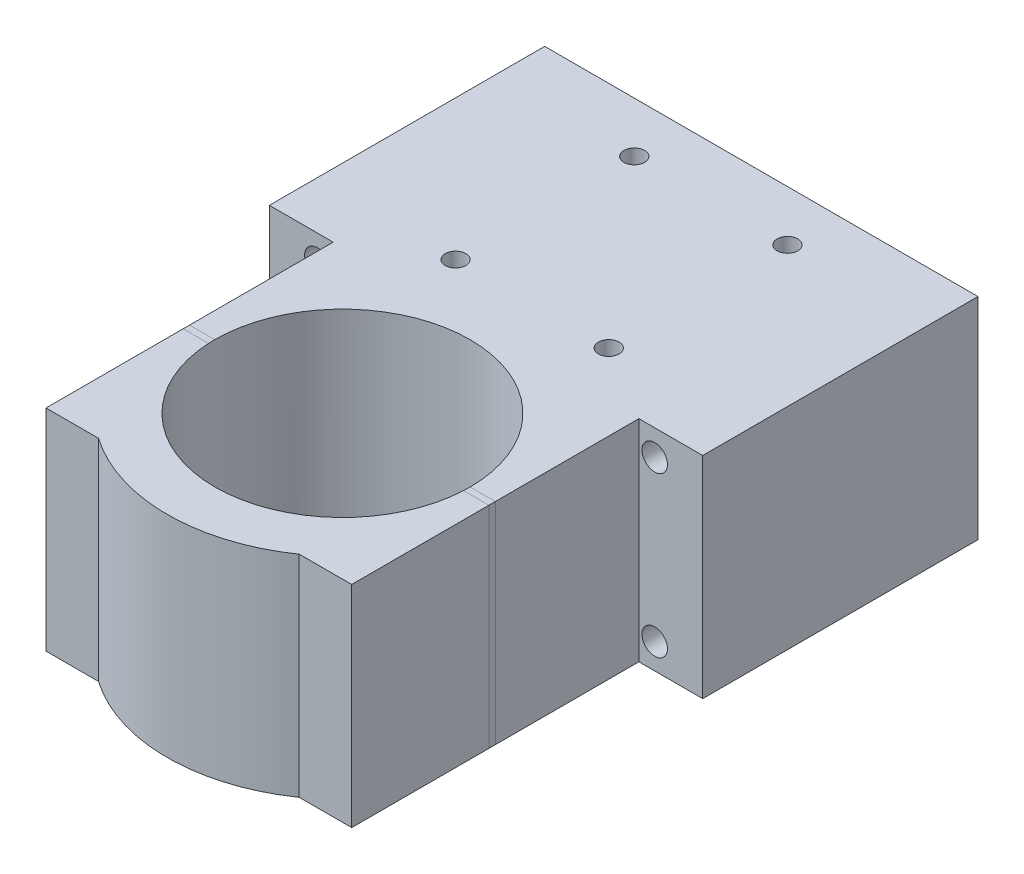
ISO-10303-21;
HEADER;
FILE_DESCRIPTION(('STEP AP214'),'2;1');
FILE_NAME('part.step','',(''),(''),'','','');
FILE_SCHEMA(('AUTOMOTIVE_DESIGN { 1 0 10303 214 1 1 1 1 }'));
ENDSEC;
DATA;
#1=APPLICATION_CONTEXT('core data for automotive mechanical design processes');
#2=APPLICATION_PROTOCOL_DEFINITION('international standard','automotive_design',2000,#1);
#3=PRODUCT_CONTEXT('',#1,'mechanical');
#4=PRODUCT('Part','Part','',(#3));
#5=PRODUCT_RELATED_PRODUCT_CATEGORY('part','',(#4));
#6=PRODUCT_DEFINITION_FORMATION('','',#4);
#7=PRODUCT_DEFINITION_CONTEXT('part definition',#1,'design');
#8=PRODUCT_DEFINITION('design','',#6,#7);
#9=PRODUCT_DEFINITION_SHAPE('','',#8);
#10=(LENGTH_UNIT() NAMED_UNIT(*) SI_UNIT(.MILLI.,.METRE.));
#11=(NAMED_UNIT(*) PLANE_ANGLE_UNIT() SI_UNIT($,.RADIAN.));
#12=(NAMED_UNIT(*) SI_UNIT($,.STERADIAN.) SOLID_ANGLE_UNIT());
#13=UNCERTAINTY_MEASURE_WITH_UNIT(LENGTH_MEASURE(1.E-05),#10,'distance_accuracy_value','');
#14=(GEOMETRIC_REPRESENTATION_CONTEXT(3) GLOBAL_UNCERTAINTY_ASSIGNED_CONTEXT((#13)) GLOBAL_UNIT_ASSIGNED_CONTEXT((#10,
#11,#12)) REPRESENTATION_CONTEXT('',''));
#15=CARTESIAN_POINT('',(0.,0.,0.));
#16=DIRECTION('',(0.,0.,1.));
#17=DIRECTION('',(1.,0.,0.));
#18=AXIS2_PLACEMENT_3D('',#15,#16,#17);
#19=CARTESIAN_POINT('',(10.5911995216749,33.,-9.67526259329469));
#20=DIRECTION('',(1.,0.,0.));
#21=DIRECTION('',(0.,0.,-1.));
#22=AXIS2_PLACEMENT_3D('',#19,#20,#21);
#23=PLANE('',#22);
#24=DIRECTION('',(0.,0.,1.));
#25=VECTOR('',#24,1.);
#26=CARTESIAN_POINT('',(10.5911995216749,0.,-9.67526259329469));
#27=LINE('',#26,#25);
#28=CARTESIAN_POINT('',(10.5911995216749,0.,13.8247374067053));
#29=VERTEX_POINT('',#28);
#30=CARTESIAN_POINT('',(10.5911995216749,0.,35.3247374067053));
#31=VERTEX_POINT('',#30);
#32=EDGE_CURVE('E275',#29,#31,#27,.T.);
#33=ORIENTED_EDGE('',*,*,#32,.F.);
#34=DIRECTION('',(0.,1.,0.));
#35=VECTOR('',#34,1.);
#36=CARTESIAN_POINT('',(10.5911995216749,33.,13.8247374067053));
#37=LINE('',#36,#35);
#38=CARTESIAN_POINT('',(10.5911995216749,33.,13.8247374067053));
#39=VERTEX_POINT('',#38);
#40=EDGE_CURVE('E12',#29,#39,#37,.T.);
#41=ORIENTED_EDGE('',*,*,#40,.T.);
#42=DIRECTION('',(0.,0.,1.));
#43=VECTOR('',#42,1.);
#44=CARTESIAN_POINT('',(10.5911995216749,33.,-9.67526259329469));
#45=LINE('',#44,#43);
#46=CARTESIAN_POINT('',(10.5911995216749,33.,35.3247374067053));
#47=VERTEX_POINT('',#46);
#48=EDGE_CURVE('E208',#39,#47,#45,.T.);
#49=ORIENTED_EDGE('',*,*,#48,.T.);
#50=DIRECTION('',(0.,-1.,0.));
#51=VECTOR('',#50,1.);
#52=CARTESIAN_POINT('',(10.5911995216749,33.,35.3247374067053));
#53=LINE('',#52,#51);
#54=EDGE_CURVE('E243',#47,#31,#53,.T.);
#55=ORIENTED_EDGE('',*,*,#54,.T.);
#56=EDGE_LOOP('',(#33,#41,#49,#55));
#57=FACE_BOUND('',#56,.T.);
#58=ADVANCED_FACE('F73',(#57),#23,.T.);
#59=ORIENTED_EDGE('',*,*,#40,.F.);
#60=CARTESIAN_POINT('',(10.5911995216749,0.,12.8247374067053));
#61=VERTEX_POINT('',#60);
#62=EDGE_CURVE('E274',#61,#29,#27,.T.);
#63=ORIENTED_EDGE('',*,*,#62,.F.);
#64=DIRECTION('',(0.,1.,0.));
#65=VECTOR('',#64,1.);
#66=CARTESIAN_POINT('',(10.5911995216749,33.,12.8247374067053));
#67=LINE('',#66,#65);
#68=CARTESIAN_POINT('',(10.5911995216749,33.,12.8247374067053));
#69=VERTEX_POINT('',#68);
#70=EDGE_CURVE('E82',#61,#69,#67,.T.);
#71=ORIENTED_EDGE('',*,*,#70,.T.);
#72=EDGE_CURVE('E311',#69,#39,#45,.T.);
#73=ORIENTED_EDGE('',*,*,#72,.T.);
#74=EDGE_LOOP('',(#59,#63,#71,#73));
#75=FACE_BOUND('',#74,.T.);
#76=ADVANCED_FACE('F458',(#75),#23,.T.);
#77=CARTESIAN_POINT('',(-13.3585479466309,33.,12.8247374067053));
#78=DIRECTION('',(0.,1.,0.));
#79=DIRECTION('',(0.,0.,1.));
#80=AXIS2_PLACEMENT_3D('',#77,#78,#79);
#81=PLANE('',#80);
#82=CARTESIAN_POINT('',(-13.3585479466309,33.,12.8247374067053));
#83=DIRECTION('',(0.,-1.,0.));
#84=DIRECTION('',(0.,0.,-1.));
#85=AXIS2_PLACEMENT_3D('',#82,#83,#84);
#86=CIRCLE('',#85,20.);
#87=CARTESIAN_POINT('',(6.64145205336908,33.,12.8247374067053));
#88=VERTEX_POINT('',#87);
#89=CARTESIAN_POINT('',(6.61643640880726,33.,13.8247374067053));
#90=VERTEX_POINT('',#89);
#91=EDGE_CURVE('E89',#88,#90,#86,.T.);
#92=ORIENTED_EDGE('',*,*,#91,.T.);
#93=DIRECTION('',(1.,0.,0.));
#94=VECTOR('',#93,1.);
#95=CARTESIAN_POINT('',(-13.3585479466309,33.,13.8247374067053));
#96=LINE('',#95,#94);
#97=EDGE_CURVE('E199',#90,#39,#96,.T.);
#98=ORIENTED_EDGE('',*,*,#97,.T.);
#99=ORIENTED_EDGE('',*,*,#72,.F.);
#100=DIRECTION('',(-1.,0.,0.));
#101=VECTOR('',#100,1.);
#102=CARTESIAN_POINT('',(-13.3585479466309,33.,12.8247374067053));
#103=LINE('',#102,#101);
#104=EDGE_CURVE('E201',#69,#88,#103,.T.);
#105=ORIENTED_EDGE('',*,*,#104,.T.);
#106=EDGE_LOOP('',(#92,#98,#99,#105));
#107=FACE_BOUND('',#106,.T.);
#108=ADVANCED_FACE('F197',(#107),#81,.T.);
#109=CARTESIAN_POINT('',(-33.3335323020691,33.,13.8247374067053));
#110=VERTEX_POINT('',#109);
#111=EDGE_CURVE('E185',#90,#110,#86,.T.);
#112=ORIENTED_EDGE('',*,*,#111,.T.);
#113=DIRECTION('',(-1.,0.,0.));
#114=VECTOR('',#113,1.);
#115=CARTESIAN_POINT('',(-13.3585479466309,33.,13.8247374067053));
#116=LINE('',#115,#114);
#117=CARTESIAN_POINT('',(-37.3082954149368,33.,13.8247374067053));
#118=VERTEX_POINT('',#117);
#119=EDGE_CURVE('E210',#110,#118,#116,.T.);
#120=ORIENTED_EDGE('',*,*,#119,.T.);
#121=DIRECTION('',(0.,0.,1.));
#122=VECTOR('',#121,1.);
#123=CARTESIAN_POINT('',(-37.3082954149368,33.,-9.67526259329467));
#124=LINE('',#123,#122);
#125=CARTESIAN_POINT('',(-37.3082954149368,33.,35.3247374067053));
#126=VERTEX_POINT('',#125);
#127=EDGE_CURVE('E327',#118,#126,#124,.T.);
#128=ORIENTED_EDGE('',*,*,#127,.T.);
#129=DIRECTION('',(1.,0.,0.));
#130=VECTOR('',#129,1.);
#131=CARTESIAN_POINT('',(-37.3082954149368,33.,35.3247374067053));
#132=LINE('',#131,#130);
#133=CARTESIAN_POINT('',(-29.0823717841637,33.,35.3247374067053));
#134=VERTEX_POINT('',#133);
#135=EDGE_CURVE('E319',#126,#134,#132,.T.);
#136=ORIENTED_EDGE('',*,*,#135,.T.);
#137=CARTESIAN_POINT('',(-13.3585479466309,33.,12.8247374067053));
#138=DIRECTION('',(0.,1.,0.));
#139=DIRECTION('',(0.,0.,1.));
#140=AXIS2_PLACEMENT_3D('',#137,#138,#139);
#141=CIRCLE('',#140,27.4497474683058);
#142=CARTESIAN_POINT('',(2.36527589090183,33.,35.3247374067053));
#143=VERTEX_POINT('',#142);
#144=EDGE_CURVE('E316',#134,#143,#141,.T.);
#145=ORIENTED_EDGE('',*,*,#144,.T.);
#146=DIRECTION('',(-1.,0.,0.));
#147=VECTOR('',#146,1.);
#148=CARTESIAN_POINT('',(10.5911995216749,33.,35.3247374067053));
#149=LINE('',#148,#147);
#150=EDGE_CURVE('E312',#47,#143,#149,.T.);
#151=ORIENTED_EDGE('',*,*,#150,.F.);
#152=ORIENTED_EDGE('',*,*,#48,.F.);
#153=ORIENTED_EDGE('',*,*,#97,.F.);
#154=EDGE_LOOP('',(#112,#120,#128,#136,#145,#151,#152,#153));
#155=FACE_BOUND('',#154,.T.);
#156=ADVANCED_FACE('F206',(#155),#81,.T.);
#157=CARTESIAN_POINT('',(-33.3585479466309,33.,12.8247374067053));
#158=VERTEX_POINT('',#157);
#159=EDGE_CURVE('E189',#110,#158,#86,.T.);
#160=ORIENTED_EDGE('',*,*,#159,.T.);
#161=DIRECTION('',(-1.,0.,0.));
#162=VECTOR('',#161,1.);
#163=CARTESIAN_POINT('',(-13.3585479466309,33.,12.8247374067053));
#164=LINE('',#163,#162);
#165=CARTESIAN_POINT('',(-37.3082954149368,33.,12.8247374067053));
#166=VERTEX_POINT('',#165);
#167=EDGE_CURVE('E219',#158,#166,#164,.T.);
#168=ORIENTED_EDGE('',*,*,#167,.T.);
#169=EDGE_CURVE('E326',#166,#118,#124,.T.);
#170=ORIENTED_EDGE('',*,*,#169,.T.);
#171=ORIENTED_EDGE('',*,*,#119,.F.);
#172=EDGE_LOOP('',(#160,#168,#170,#171));
#173=FACE_BOUND('',#172,.T.);
#174=ADVANCED_FACE('F418',(#173),#81,.T.);
#175=CARTESIAN_POINT('',(-37.3082954149368,33.,-9.67526259329467));
#176=DIRECTION('',(1.,0.,0.));
#177=DIRECTION('',(0.,0.,-1.));
#178=AXIS2_PLACEMENT_3D('',#175,#176,#177);
#179=PLANE('',#178);
#180=DIRECTION('',(0.,-1.,0.));
#181=VECTOR('',#180,1.);
#182=CARTESIAN_POINT('',(-37.3082954149368,33.,13.8247374067053));
#183=LINE('',#182,#181);
#184=CARTESIAN_POINT('',(-37.3082954149368,0.,13.8247374067053));
#185=VERTEX_POINT('',#184);
#186=EDGE_CURVE('E222',#118,#185,#183,.T.);
#187=ORIENTED_EDGE('',*,*,#186,.F.);
#188=ORIENTED_EDGE('',*,*,#169,.F.);
#189=DIRECTION('',(0.,-1.,0.));
#190=VECTOR('',#189,1.);
#191=CARTESIAN_POINT('',(-37.3082954149368,33.,12.8247374067053));
#192=LINE('',#191,#190);
#193=CARTESIAN_POINT('',(-37.3082954149368,0.,12.8247374067053));
#194=VERTEX_POINT('',#193);
#195=EDGE_CURVE('E225',#166,#194,#192,.T.);
#196=ORIENTED_EDGE('',*,*,#195,.T.);
#197=DIRECTION('',(0.,0.,1.));
#198=VECTOR('',#197,1.);
#199=CARTESIAN_POINT('',(-37.3082954149368,0.,-9.67526259329467));
#200=LINE('',#199,#198);
#201=EDGE_CURVE('E291',#194,#185,#200,.T.);
#202=ORIENTED_EDGE('',*,*,#201,.T.);
#203=EDGE_LOOP('',(#187,#188,#196,#202));
#204=FACE_BOUND('',#203,.T.);
#205=ADVANCED_FACE('F432',(#204),#179,.F.);
#206=ORIENTED_EDGE('',*,*,#195,.F.);
#207=CARTESIAN_POINT('',(-37.3082954149368,33.,-9.67526259329467));
#208=VERTEX_POINT('',#207);
#209=EDGE_CURVE('E322',#208,#166,#124,.T.);
#210=ORIENTED_EDGE('',*,*,#209,.F.);
#211=DIRECTION('',(0.,-1.,0.));
#212=VECTOR('',#211,1.);
#213=CARTESIAN_POINT('',(-37.3082954149368,33.,-9.67526259329467));
#214=LINE('',#213,#212);
#215=CARTESIAN_POINT('',(-37.3082954149368,0.,-9.67526259329467));
#216=VERTEX_POINT('',#215);
#217=EDGE_CURVE('E228',#208,#216,#214,.T.);
#218=ORIENTED_EDGE('',*,*,#217,.T.);
#219=EDGE_CURVE('E287',#216,#194,#200,.T.);
#220=ORIENTED_EDGE('',*,*,#219,.T.);
#221=EDGE_LOOP('',(#206,#210,#218,#220));
#222=FACE_BOUND('',#221,.T.);
#223=ADVANCED_FACE('F426',(#222),#179,.F.);
#224=EDGE_CURVE('E204',#158,#88,#86,.T.);
#225=ORIENTED_EDGE('',*,*,#224,.T.);
#226=ORIENTED_EDGE('',*,*,#104,.F.);
#227=CARTESIAN_POINT('',(10.5911995216749,33.,-9.67526259329469));
#228=VERTEX_POINT('',#227);
#229=EDGE_CURVE('E307',#228,#69,#45,.T.);
#230=ORIENTED_EDGE('',*,*,#229,.F.);
#231=DIRECTION('',(1.,0.,0.));
#232=VECTOR('',#231,1.);
#233=CARTESIAN_POINT('',(10.5911995216749,33.,-9.67526259329469));
#234=LINE('',#233,#232);
#235=CARTESIAN_POINT('',(20.5911995216749,33.,-9.67526259329469));
#236=VERTEX_POINT('',#235);
#237=EDGE_CURVE('E304',#228,#236,#234,.T.);
#238=ORIENTED_EDGE('',*,*,#237,.T.);
#239=DIRECTION('',(0.,0.,1.));
#240=VECTOR('',#239,1.);
#241=CARTESIAN_POINT('',(20.5911995216749,33.,-17.8159661108826));
#242=LINE('',#241,#240);
#243=CARTESIAN_POINT('',(20.5911995216749,33.,-52.8159661108826));
#244=VERTEX_POINT('',#243);
#245=EDGE_CURVE('E300',#244,#236,#242,.T.);
#246=ORIENTED_EDGE('',*,*,#245,.F.);
#247=DIRECTION('',(-1.,0.,0.));
#248=VECTOR('',#247,1.);
#249=CARTESIAN_POINT('',(-47.3082954149368,33.,-52.8159661108826));
#250=LINE('',#249,#248);
#251=CARTESIAN_POINT('',(-47.3082954149368,33.,-52.8159661108826));
#252=VERTEX_POINT('',#251);
#253=EDGE_CURVE('E371',#244,#252,#250,.T.);
#254=ORIENTED_EDGE('',*,*,#253,.T.);
#255=DIRECTION('',(0.,0.,1.));
#256=VECTOR('',#255,1.);
#257=CARTESIAN_POINT('',(-47.3082954149368,33.,-17.8159661108826));
#258=LINE('',#257,#256);
#259=CARTESIAN_POINT('',(-47.3082954149368,33.,-9.67526259329467));
#260=VERTEX_POINT('',#259);
#261=EDGE_CURVE('E257',#252,#260,#258,.T.);
#262=ORIENTED_EDGE('',*,*,#261,.T.);
#263=DIRECTION('',(1.,0.,0.));
#264=VECTOR('',#263,1.);
#265=CARTESIAN_POINT('',(-47.3082954149368,33.,-9.67526259329467));
#266=LINE('',#265,#264);
#267=EDGE_CURVE('E261',#260,#208,#266,.T.);
#268=ORIENTED_EDGE('',*,*,#267,.T.);
#269=ORIENTED_EDGE('',*,*,#209,.T.);
#270=ORIENTED_EDGE('',*,*,#167,.F.);
#271=EDGE_LOOP('',(#225,#226,#230,#238,#246,#254,#262,#268,#269,#270));
#272=FACE_BOUND('',#271,.T.);
#273=CARTESIAN_POINT('',(-1.35829541493676,33.,-16.8999709205909));
#274=DIRECTION('',(0.,1.,0.));
#275=DIRECTION('',(0.,0.,1.));
#276=AXIS2_PLACEMENT_3D('',#273,#274,#275);
#277=CIRCLE('',#276,1.62);
#278=CARTESIAN_POINT('',(-1.35829541493676,33.,-15.2799709205909));
#279=VERTEX_POINT('',#278);
#280=EDGE_CURVE('E396',#279,#279,#277,.T.);
#281=ORIENTED_EDGE('',*,*,#280,.F.);
#282=EDGE_LOOP('',(#281));
#283=FACE_BOUND('',#282,.T.);
#284=CARTESIAN_POINT('',(-25.3582954149368,33.,-44.8999709205909));
#285=DIRECTION('',(0.,1.,0.));
#286=DIRECTION('',(0.,0.,1.));
#287=AXIS2_PLACEMENT_3D('',#284,#285,#286);
#288=CIRCLE('',#287,1.62);
#289=CARTESIAN_POINT('',(-25.3582954149368,33.,-43.2799709205909));
#290=VERTEX_POINT('',#289);
#291=EDGE_CURVE('E387',#290,#290,#288,.T.);
#292=ORIENTED_EDGE('',*,*,#291,.F.);
#293=EDGE_LOOP('',(#292));
#294=FACE_BOUND('',#293,.T.);
#295=CARTESIAN_POINT('',(-1.35829541493676,33.,-44.8999709205909));
#296=DIRECTION('',(0.,1.,0.));
#297=DIRECTION('',(0.,0.,1.));
#298=AXIS2_PLACEMENT_3D('',#295,#296,#297);
#299=CIRCLE('',#298,1.62);
#300=CARTESIAN_POINT('',(-1.35829541493676,33.,-43.2799709205909));
#301=VERTEX_POINT('',#300);
#302=EDGE_CURVE('E203',#301,#301,#299,.T.);
#303=ORIENTED_EDGE('',*,*,#302,.F.);
#304=EDGE_LOOP('',(#303));
#305=FACE_BOUND('',#304,.T.);
#306=CARTESIAN_POINT('',(-25.3582954149368,33.,-16.8999709205909));
#307=DIRECTION('',(0.,1.,0.));
#308=DIRECTION('',(0.,0.,1.));
#309=AXIS2_PLACEMENT_3D('',#306,#307,#308);
#310=CIRCLE('',#309,1.62);
#311=CARTESIAN_POINT('',(-25.3582954149368,33.,-15.2799709205909));
#312=VERTEX_POINT('',#311);
#313=EDGE_CURVE('E379',#312,#312,#310,.T.);
#314=ORIENTED_EDGE('',*,*,#313,.F.);
#315=EDGE_LOOP('',(#314));
#316=FACE_BOUND('',#315,.T.);
#317=ADVANCED_FACE('F421',(#272,#283,#294,#305,#316),#81,.T.);
#318=CARTESIAN_POINT('',(-13.3585479466309,0.,12.8247374067053));
#319=DIRECTION('',(0.,1.,0.));
#320=DIRECTION('',(0.,0.,1.));
#321=AXIS2_PLACEMENT_3D('',#318,#319,#320);
#322=PLANE('',#321);
#323=CARTESIAN_POINT('',(-13.3585479466309,0.,12.8247374067053));
#324=DIRECTION('',(0.,-1.,0.));
#325=DIRECTION('',(0.,0.,-1.));
#326=AXIS2_PLACEMENT_3D('',#323,#324,#325);
#327=CIRCLE('',#326,20.);
#328=CARTESIAN_POINT('',(-13.3585479466309,0.,-7.17526259329469));
#329=VERTEX_POINT('',#328);
#330=EDGE_CURVE('E409',#329,#329,#327,.T.);
#331=ORIENTED_EDGE('',*,*,#330,.F.);
#332=EDGE_LOOP('',(#331));
#333=FACE_BOUND('',#332,.T.);
#334=DIRECTION('',(1.,0.,0.));
#335=VECTOR('',#334,1.);
#336=CARTESIAN_POINT('',(-47.3082954149368,0.,-9.67526259329467));
#337=LINE('',#336,#335);
#338=CARTESIAN_POINT('',(-47.3082954149368,0.,-9.67526259329467));
#339=VERTEX_POINT('',#338);
#340=EDGE_CURVE('E293',#339,#216,#337,.T.);
#341=ORIENTED_EDGE('',*,*,#340,.F.);
#342=DIRECTION('',(0.,0.,1.));
#343=VECTOR('',#342,1.);
#344=CARTESIAN_POINT('',(-47.3082954149368,0.,-17.8159661108826));
#345=LINE('',#344,#343);
#346=CARTESIAN_POINT('',(-47.3082954149368,0.,-52.8159661108826));
#347=VERTEX_POINT('',#346);
#348=EDGE_CURVE('E258',#347,#339,#345,.T.);
#349=ORIENTED_EDGE('',*,*,#348,.F.);
#350=DIRECTION('',(-1.,0.,0.));
#351=VECTOR('',#350,1.);
#352=CARTESIAN_POINT('',(-47.3082954149368,0.,-52.8159661108826));
#353=LINE('',#352,#351);
#354=CARTESIAN_POINT('',(20.5911995216749,0.,-52.8159661108826));
#355=VERTEX_POINT('',#354);
#356=EDGE_CURVE('E367',#355,#347,#353,.T.);
#357=ORIENTED_EDGE('',*,*,#356,.F.);
#358=DIRECTION('',(0.,0.,1.));
#359=VECTOR('',#358,1.);
#360=CARTESIAN_POINT('',(20.5911995216749,0.,-17.8159661108826));
#361=LINE('',#360,#359);
#362=CARTESIAN_POINT('',(20.5911995216749,0.,-9.67526259329469));
#363=VERTEX_POINT('',#362);
#364=EDGE_CURVE('E262',#355,#363,#361,.T.);
#365=ORIENTED_EDGE('',*,*,#364,.T.);
#366=DIRECTION('',(1.,0.,0.));
#367=VECTOR('',#366,1.);
#368=CARTESIAN_POINT('',(10.5911995216749,0.,-9.67526259329469));
#369=LINE('',#368,#367);
#370=CARTESIAN_POINT('',(10.5911995216749,0.,-9.67526259329469));
#371=VERTEX_POINT('',#370);
#372=EDGE_CURVE('E266',#371,#363,#369,.T.);
#373=ORIENTED_EDGE('',*,*,#372,.F.);
#374=EDGE_CURVE('E270',#371,#61,#27,.T.);
#375=ORIENTED_EDGE('',*,*,#374,.T.);
#376=ORIENTED_EDGE('',*,*,#62,.T.);
#377=ORIENTED_EDGE('',*,*,#32,.T.);
#378=DIRECTION('',(-1.,0.,0.));
#379=VECTOR('',#378,1.);
#380=CARTESIAN_POINT('',(10.5911995216749,0.,35.3247374067053));
#381=LINE('',#380,#379);
#382=CARTESIAN_POINT('',(2.36527589090183,0.,35.3247374067053));
#383=VERTEX_POINT('',#382);
#384=EDGE_CURVE('E276',#31,#383,#381,.T.);
#385=ORIENTED_EDGE('',*,*,#384,.T.);
#386=CARTESIAN_POINT('',(-13.3585479466309,0.,12.8247374067053));
#387=DIRECTION('',(0.,1.,0.));
#388=DIRECTION('',(0.,0.,1.));
#389=AXIS2_PLACEMENT_3D('',#386,#387,#388);
#390=CIRCLE('',#389,27.4497474683058);
#391=CARTESIAN_POINT('',(-29.0823717841637,0.,35.3247374067053));
#392=VERTEX_POINT('',#391);
#393=EDGE_CURVE('E280',#392,#383,#390,.T.);
#394=ORIENTED_EDGE('',*,*,#393,.F.);
#395=DIRECTION('',(1.,0.,0.));
#396=VECTOR('',#395,1.);
#397=CARTESIAN_POINT('',(-37.3082954149368,0.,35.3247374067053));
#398=LINE('',#397,#396);
#399=CARTESIAN_POINT('',(-37.3082954149368,0.,35.3247374067053));
#400=VERTEX_POINT('',#399);
#401=EDGE_CURVE('E284',#400,#392,#398,.T.);
#402=ORIENTED_EDGE('',*,*,#401,.F.);
#403=EDGE_CURVE('E292',#185,#400,#200,.T.);
#404=ORIENTED_EDGE('',*,*,#403,.F.);
#405=ORIENTED_EDGE('',*,*,#201,.F.);
#406=ORIENTED_EDGE('',*,*,#219,.F.);
#407=EDGE_LOOP('',(#341,#349,#357,#365,#373,#375,#376,#377,#385,#394,#402,#404,#405,#406));
#408=FACE_BOUND('',#407,.T.);
#409=ADVANCED_FACE('F482',(#333,#408),#322,.F.);
#410=CARTESIAN_POINT('',(-47.3082954149368,33.,-9.67526259329467));
#411=DIRECTION('',(0.,0.,-1.));
#412=DIRECTION('',(-1.,0.,0.));
#413=AXIS2_PLACEMENT_3D('',#410,#411,#412);
#414=PLANE('',#413);
#415=CARTESIAN_POINT('',(-39.7882954149368,29.,-9.67526259329467));
#416=DIRECTION('',(0.,0.,-1.));
#417=DIRECTION('',(-1.,0.,0.));
#418=AXIS2_PLACEMENT_3D('',#415,#416,#417);
#419=CIRCLE('',#418,2.);
#420=CARTESIAN_POINT('',(-41.7882954149368,29.,-9.67526259329467));
#421=VERTEX_POINT('',#420);
#422=EDGE_CURVE('E338',#421,#421,#419,.T.);
#423=ORIENTED_EDGE('',*,*,#422,.T.);
#424=EDGE_LOOP('',(#423));
#425=FACE_BOUND('',#424,.T.);
#426=CARTESIAN_POINT('',(-39.7882954149368,4.,-9.67526259329467));
#427=DIRECTION('',(0.,0.,-1.));
#428=DIRECTION('',(-1.,0.,0.));
#429=AXIS2_PLACEMENT_3D('',#426,#427,#428);
#430=CIRCLE('',#429,2.);
#431=CARTESIAN_POINT('',(-41.7882954149368,4.,-9.67526259329467));
#432=VERTEX_POINT('',#431);
#433=EDGE_CURVE('E342',#432,#432,#430,.T.);
#434=ORIENTED_EDGE('',*,*,#433,.T.);
#435=EDGE_LOOP('',(#434));
#436=FACE_BOUND('',#435,.T.);
#437=ORIENTED_EDGE('',*,*,#340,.T.);
#438=ORIENTED_EDGE('',*,*,#217,.F.);
#439=ORIENTED_EDGE('',*,*,#267,.F.);
#440=DIRECTION('',(0.,-1.,0.));
#441=VECTOR('',#440,1.);
#442=CARTESIAN_POINT('',(-47.3082954149368,33.,-9.67526259329467));
#443=LINE('',#442,#441);
#444=EDGE_CURVE('E253',#260,#339,#443,.T.);
#445=ORIENTED_EDGE('',*,*,#444,.T.);
#446=EDGE_LOOP('',(#437,#438,#439,#445));
#447=FACE_BOUND('',#446,.T.);
#448=ADVANCED_FACE('F75',(#425,#436,#447),#414,.F.);
#449=ORIENTED_EDGE('',*,*,#127,.F.);
#450=ORIENTED_EDGE('',*,*,#186,.T.);
#451=ORIENTED_EDGE('',*,*,#403,.T.);
#452=DIRECTION('',(0.,-1.,0.));
#453=VECTOR('',#452,1.);
#454=CARTESIAN_POINT('',(-37.3082954149368,33.,35.3247374067053));
#455=LINE('',#454,#453);
#456=EDGE_CURVE('E232',#126,#400,#455,.T.);
#457=ORIENTED_EDGE('',*,*,#456,.F.);
#458=EDGE_LOOP('',(#449,#450,#451,#457));
#459=FACE_BOUND('',#458,.T.);
#460=ADVANCED_FACE('F440',(#459),#179,.F.);
#461=CARTESIAN_POINT('',(-37.3082954149368,33.,35.3247374067053));
#462=DIRECTION('',(0.,0.,-1.));
#463=DIRECTION('',(-1.,0.,0.));
#464=AXIS2_PLACEMENT_3D('',#461,#462,#463);
#465=PLANE('',#464);
#466=ORIENTED_EDGE('',*,*,#401,.T.);
#467=DIRECTION('',(0.,-1.,0.));
#468=VECTOR('',#467,1.);
#469=CARTESIAN_POINT('',(-29.0823717841637,33.,35.3247374067053));
#470=LINE('',#469,#468);
#471=EDGE_CURVE('E236',#134,#392,#470,.T.);
#472=ORIENTED_EDGE('',*,*,#471,.F.);
#473=ORIENTED_EDGE('',*,*,#135,.F.);
#474=ORIENTED_EDGE('',*,*,#456,.T.);
#475=EDGE_LOOP('',(#466,#472,#473,#474));
#476=FACE_BOUND('',#475,.T.);
#477=ADVANCED_FACE('F444',(#476),#465,.F.);
#478=CARTESIAN_POINT('',(-13.3585479466309,33.,12.8247374067053));
#479=DIRECTION('',(0.,-1.,0.));
#480=DIRECTION('',(0.,0.,-1.));
#481=AXIS2_PLACEMENT_3D('',#478,#479,#480);
#482=CYLINDRICAL_SURFACE('',#481,27.4497474683058);
#483=ORIENTED_EDGE('',*,*,#393,.T.);
#484=DIRECTION('',(0.,-1.,0.));
#485=VECTOR('',#484,1.);
#486=CARTESIAN_POINT('',(2.36527589090183,33.,35.3247374067053));
#487=LINE('',#486,#485);
#488=EDGE_CURVE('E240',#143,#383,#487,.T.);
#489=ORIENTED_EDGE('',*,*,#488,.F.);
#490=ORIENTED_EDGE('',*,*,#144,.F.);
#491=ORIENTED_EDGE('',*,*,#471,.T.);
#492=EDGE_LOOP('',(#483,#489,#490,#491));
#493=FACE_BOUND('',#492,.T.);
#494=ADVANCED_FACE('F449',(#493),#482,.T.);
#495=CARTESIAN_POINT('',(10.5911995216749,33.,35.3247374067053));
#496=DIRECTION('',(0.,0.,1.));
#497=DIRECTION('',(1.,0.,0.));
#498=AXIS2_PLACEMENT_3D('',#495,#496,#497);
#499=PLANE('',#498);
#500=ORIENTED_EDGE('',*,*,#384,.F.);
#501=ORIENTED_EDGE('',*,*,#54,.F.);
#502=ORIENTED_EDGE('',*,*,#150,.T.);
#503=ORIENTED_EDGE('',*,*,#488,.T.);
#504=EDGE_LOOP('',(#500,#501,#502,#503));
#505=FACE_BOUND('',#504,.T.);
#506=ADVANCED_FACE('F453',(#505),#499,.T.);
#507=ORIENTED_EDGE('',*,*,#70,.F.);
#508=ORIENTED_EDGE('',*,*,#374,.F.);
#509=DIRECTION('',(0.,-1.,0.));
#510=VECTOR('',#509,1.);
#511=CARTESIAN_POINT('',(10.5911995216749,33.,-9.67526259329469));
#512=LINE('',#511,#510);
#513=EDGE_CURVE('E247',#228,#371,#512,.T.);
#514=ORIENTED_EDGE('',*,*,#513,.F.);
#515=ORIENTED_EDGE('',*,*,#229,.T.);
#516=EDGE_LOOP('',(#507,#508,#514,#515));
#517=FACE_BOUND('',#516,.T.);
#518=ADVANCED_FACE('F461',(#517),#23,.T.);
#519=CARTESIAN_POINT('',(10.5911995216749,33.,-9.67526259329469));
#520=DIRECTION('',(0.,0.,-1.));
#521=DIRECTION('',(-1.,0.,0.));
#522=AXIS2_PLACEMENT_3D('',#519,#520,#521);
#523=PLANE('',#522);
#524=CARTESIAN_POINT('',(13.0711995216749,4.,-9.67526259329469));
#525=DIRECTION('',(0.,0.,-1.));
#526=DIRECTION('',(-1.,0.,0.));
#527=AXIS2_PLACEMENT_3D('',#524,#525,#526);
#528=CIRCLE('',#527,2.);
#529=CARTESIAN_POINT('',(11.0711995216749,4.,-9.67526259329469));
#530=VERTEX_POINT('',#529);
#531=EDGE_CURVE('E297',#530,#530,#528,.T.);
#532=ORIENTED_EDGE('',*,*,#531,.T.);
#533=EDGE_LOOP('',(#532));
#534=FACE_BOUND('',#533,.T.);
#535=CARTESIAN_POINT('',(13.0711995216749,29.,-9.67526259329469));
#536=DIRECTION('',(0.,0.,-1.));
#537=DIRECTION('',(-1.,0.,0.));
#538=AXIS2_PLACEMENT_3D('',#535,#536,#537);
#539=CIRCLE('',#538,2.);
#540=CARTESIAN_POINT('',(11.0711995216749,29.,-9.67526259329469));
#541=VERTEX_POINT('',#540);
#542=EDGE_CURVE('E334',#541,#541,#539,.T.);
#543=ORIENTED_EDGE('',*,*,#542,.T.);
#544=EDGE_LOOP('',(#543));
#545=FACE_BOUND('',#544,.T.);
#546=ORIENTED_EDGE('',*,*,#372,.T.);
#547=DIRECTION('',(0.,-1.,0.));
#548=VECTOR('',#547,1.);
#549=CARTESIAN_POINT('',(20.5911995216749,33.,-9.67526259329469));
#550=LINE('',#549,#548);
#551=EDGE_CURVE('E250',#236,#363,#550,.T.);
#552=ORIENTED_EDGE('',*,*,#551,.F.);
#553=ORIENTED_EDGE('',*,*,#237,.F.);
#554=ORIENTED_EDGE('',*,*,#513,.T.);
#555=EDGE_LOOP('',(#546,#552,#553,#554));
#556=FACE_BOUND('',#555,.T.);
#557=ADVANCED_FACE('F466',(#534,#545,#556),#523,.F.);
#558=CARTESIAN_POINT('',(20.5911995216749,33.,-17.8159661108826));
#559=DIRECTION('',(1.,0.,0.));
#560=DIRECTION('',(0.,0.,-1.));
#561=AXIS2_PLACEMENT_3D('',#558,#559,#560);
#562=PLANE('',#561);
#563=ORIENTED_EDGE('',*,*,#364,.F.);
#564=DIRECTION('',(0.,1.,0.));
#565=VECTOR('',#564,1.);
#566=CARTESIAN_POINT('',(20.5911995216749,0.,-52.8159661108826));
#567=LINE('',#566,#565);
#568=EDGE_CURVE('E363',#355,#244,#567,.T.);
#569=ORIENTED_EDGE('',*,*,#568,.T.);
#570=ORIENTED_EDGE('',*,*,#245,.T.);
#571=ORIENTED_EDGE('',*,*,#551,.T.);
#572=EDGE_LOOP('',(#563,#569,#570,#571));
#573=FACE_BOUND('',#572,.T.);
#574=ADVANCED_FACE('F469',(#573),#562,.T.);
#575=CARTESIAN_POINT('',(-47.3082954149368,33.,-17.8159661108826));
#576=DIRECTION('',(1.,0.,0.));
#577=DIRECTION('',(0.,0.,-1.));
#578=AXIS2_PLACEMENT_3D('',#575,#576,#577);
#579=PLANE('',#578);
#580=ORIENTED_EDGE('',*,*,#348,.T.);
#581=ORIENTED_EDGE('',*,*,#444,.F.);
#582=ORIENTED_EDGE('',*,*,#261,.F.);
#583=DIRECTION('',(0.,1.,0.));
#584=VECTOR('',#583,1.);
#585=CARTESIAN_POINT('',(-47.3082954149368,0.,-52.8159661108826));
#586=LINE('',#585,#584);
#587=EDGE_CURVE('E352',#347,#252,#586,.T.);
#588=ORIENTED_EDGE('',*,*,#587,.F.);
#589=EDGE_LOOP('',(#580,#581,#582,#588));
#590=FACE_BOUND('',#589,.T.);
#591=ADVANCED_FACE('F478',(#590),#579,.F.);
#592=CARTESIAN_POINT('',(-39.7882954149368,4.,-7.8159661108826));
#593=DIRECTION('',(0.,0.,-1.));
#594=DIRECTION('',(-1.,0.,0.));
#595=AXIS2_PLACEMENT_3D('',#592,#593,#594);
#596=CYLINDRICAL_SURFACE('',#595,2.);
#597=CARTESIAN_POINT('',(-39.7882954149368,4.,-17.8159661108826));
#598=DIRECTION('',(0.,0.,-1.));
#599=DIRECTION('',(-1.,0.,0.));
#600=AXIS2_PLACEMENT_3D('',#597,#598,#599);
#601=CIRCLE('',#600,2.);
#602=CARTESIAN_POINT('',(-41.7882954149368,4.,-17.8159661108826));
#603=VERTEX_POINT('',#602);
#604=EDGE_CURVE('E347',#603,#603,#601,.T.);
#605=ORIENTED_EDGE('',*,*,#604,.T.);
#606=EDGE_LOOP('',(#605));
#607=FACE_BOUND('',#606,.T.);
#608=ORIENTED_EDGE('',*,*,#433,.F.);
#609=EDGE_LOOP('',(#608));
#610=FACE_BOUND('',#609,.T.);
#611=ADVANCED_FACE('F550',(#607,#610),#596,.F.);
#612=CARTESIAN_POINT('',(-39.7882954149368,29.,-7.8159661108826));
#613=DIRECTION('',(0.,0.,-1.));
#614=DIRECTION('',(-1.,0.,0.));
#615=AXIS2_PLACEMENT_3D('',#612,#613,#614);
#616=CYLINDRICAL_SURFACE('',#615,2.);
#617=CARTESIAN_POINT('',(-39.7882954149368,29.,-17.8159661108826));
#618=DIRECTION('',(0.,0.,-1.));
#619=DIRECTION('',(-1.,0.,0.));
#620=AXIS2_PLACEMENT_3D('',#617,#618,#619);
#621=CIRCLE('',#620,2.);
#622=CARTESIAN_POINT('',(-41.7882954149368,29.,-17.8159661108826));
#623=VERTEX_POINT('',#622);
#624=EDGE_CURVE('E351',#623,#623,#621,.T.);
#625=ORIENTED_EDGE('',*,*,#624,.T.);
#626=EDGE_LOOP('',(#625));
#627=FACE_BOUND('',#626,.T.);
#628=ORIENTED_EDGE('',*,*,#422,.F.);
#629=EDGE_LOOP('',(#628));
#630=FACE_BOUND('',#629,.T.);
#631=ADVANCED_FACE('F554',(#627,#630),#616,.F.);
#632=CARTESIAN_POINT('',(13.0711995216749,29.,-7.8159661108826));
#633=DIRECTION('',(0.,0.,-1.));
#634=DIRECTION('',(-1.,0.,0.));
#635=AXIS2_PLACEMENT_3D('',#632,#633,#634);
#636=CYLINDRICAL_SURFACE('',#635,2.);
#637=CARTESIAN_POINT('',(13.0711995216749,29.,-17.8159661108826));
#638=DIRECTION('',(0.,0.,-1.));
#639=DIRECTION('',(-1.,0.,0.));
#640=AXIS2_PLACEMENT_3D('',#637,#638,#639);
#641=CIRCLE('',#640,2.);
#642=CARTESIAN_POINT('',(11.0711995216749,29.,-17.8159661108826));
#643=VERTEX_POINT('',#642);
#644=EDGE_CURVE('E356',#643,#643,#641,.T.);
#645=ORIENTED_EDGE('',*,*,#644,.T.);
#646=EDGE_LOOP('',(#645));
#647=FACE_BOUND('',#646,.T.);
#648=ORIENTED_EDGE('',*,*,#542,.F.);
#649=EDGE_LOOP('',(#648));
#650=FACE_BOUND('',#649,.T.);
#651=ADVANCED_FACE('F564',(#647,#650),#636,.F.);
#652=CARTESIAN_POINT('',(13.0711995216749,4.,-7.8159661108826));
#653=DIRECTION('',(0.,0.,-1.));
#654=DIRECTION('',(-1.,0.,0.));
#655=AXIS2_PLACEMENT_3D('',#652,#653,#654);
#656=CYLINDRICAL_SURFACE('',#655,2.);
#657=CARTESIAN_POINT('',(13.0711995216749,4.,-17.8159661108826));
#658=DIRECTION('',(0.,0.,-1.));
#659=DIRECTION('',(-1.,0.,0.));
#660=AXIS2_PLACEMENT_3D('',#657,#658,#659);
#661=CIRCLE('',#660,2.);
#662=CARTESIAN_POINT('',(11.0711995216749,4.,-17.8159661108826));
#663=VERTEX_POINT('',#662);
#664=EDGE_CURVE('E346',#663,#663,#661,.T.);
#665=ORIENTED_EDGE('',*,*,#664,.T.);
#666=EDGE_LOOP('',(#665));
#667=FACE_BOUND('',#666,.T.);
#668=ORIENTED_EDGE('',*,*,#531,.F.);
#669=EDGE_LOOP('',(#668));
#670=FACE_BOUND('',#669,.T.);
#671=ADVANCED_FACE('F574',(#667,#670),#656,.F.);
#672=CARTESIAN_POINT('',(-47.3082954149368,0.,-17.8159661108826));
#673=DIRECTION('',(0.,0.,1.));
#674=DIRECTION('',(1.,0.,0.));
#675=AXIS2_PLACEMENT_3D('',#672,#673,#674);
#676=PLANE('',#675);
#677=ORIENTED_EDGE('',*,*,#604,.F.);
#678=EDGE_LOOP('',(#677));
#679=FACE_BOUND('',#678,.T.);
#680=ADVANCED_FACE('F584',(#679),#676,.T.);
#681=ORIENTED_EDGE('',*,*,#624,.F.);
#682=EDGE_LOOP('',(#681));
#683=FACE_BOUND('',#682,.T.);
#684=ADVANCED_FACE('F613',(#683),#676,.T.);
#685=ORIENTED_EDGE('',*,*,#644,.F.);
#686=EDGE_LOOP('',(#685));
#687=FACE_BOUND('',#686,.T.);
#688=ADVANCED_FACE('F624',(#687),#676,.T.);
#689=ORIENTED_EDGE('',*,*,#664,.F.);
#690=EDGE_LOOP('',(#689));
#691=FACE_BOUND('',#690,.T.);
#692=ADVANCED_FACE('F616',(#691),#676,.T.);
#693=CARTESIAN_POINT('',(-47.3082954149368,0.,-52.8159661108826));
#694=DIRECTION('',(0.,0.,-1.));
#695=DIRECTION('',(-1.,0.,0.));
#696=AXIS2_PLACEMENT_3D('',#693,#694,#695);
#697=PLANE('',#696);
#698=ORIENTED_EDGE('',*,*,#253,.F.);
#699=ORIENTED_EDGE('',*,*,#568,.F.);
#700=ORIENTED_EDGE('',*,*,#356,.T.);
#701=ORIENTED_EDGE('',*,*,#587,.T.);
#702=EDGE_LOOP('',(#698,#699,#700,#701));
#703=FACE_BOUND('',#702,.T.);
#704=ADVANCED_FACE('F474',(#703),#697,.T.);
#705=CARTESIAN_POINT('',(-25.3582954149368,23.,-16.8999709205909));
#706=DIRECTION('',(0.,1.,0.));
#707=DIRECTION('',(0.,0.,1.));
#708=AXIS2_PLACEMENT_3D('',#705,#706,#707);
#709=CYLINDRICAL_SURFACE('',#708,1.62);
#710=CARTESIAN_POINT('',(-25.3582954149368,23.,-16.8999709205909));
#711=DIRECTION('',(0.,1.,0.));
#712=DIRECTION('',(0.,0.,1.));
#713=AXIS2_PLACEMENT_3D('',#710,#711,#712);
#714=CIRCLE('',#713,1.62);
#715=CARTESIAN_POINT('',(-25.3582954149368,23.,-15.2799709205909));
#716=VERTEX_POINT('',#715);
#717=EDGE_CURVE('E375',#716,#716,#714,.T.);
#718=ORIENTED_EDGE('',*,*,#717,.F.);
#719=EDGE_LOOP('',(#718));
#720=FACE_BOUND('',#719,.T.);
#721=ORIENTED_EDGE('',*,*,#313,.T.);
#722=EDGE_LOOP('',(#721));
#723=FACE_BOUND('',#722,.T.);
#724=ADVANCED_FACE('F649',(#720,#723),#709,.F.);
#725=CARTESIAN_POINT('',(-25.3582954149368,23.,-16.8999709205909));
#726=DIRECTION('',(0.,1.,0.));
#727=DIRECTION('',(0.,0.,1.));
#728=AXIS2_PLACEMENT_3D('',#725,#726,#727);
#729=PLANE('',#728);
#730=ORIENTED_EDGE('',*,*,#717,.T.);
#731=EDGE_LOOP('',(#730));
#732=FACE_BOUND('',#731,.T.);
#733=ADVANCED_FACE('F658',(#732),#729,.T.);
#734=CARTESIAN_POINT('',(-1.35829541493676,23.,-44.8999709205909));
#735=DIRECTION('',(0.,1.,0.));
#736=DIRECTION('',(0.,0.,1.));
#737=AXIS2_PLACEMENT_3D('',#734,#735,#736);
#738=CYLINDRICAL_SURFACE('',#737,1.62);
#739=CARTESIAN_POINT('',(-1.35829541493676,23.,-44.8999709205909));
#740=DIRECTION('',(0.,1.,0.));
#741=DIRECTION('',(0.,0.,1.));
#742=AXIS2_PLACEMENT_3D('',#739,#740,#741);
#743=CIRCLE('',#742,1.62);
#744=CARTESIAN_POINT('',(-1.35829541493676,23.,-43.2799709205909));
#745=VERTEX_POINT('',#744);
#746=EDGE_CURVE('E392',#745,#745,#743,.T.);
#747=ORIENTED_EDGE('',*,*,#746,.F.);
#748=EDGE_LOOP('',(#747));
#749=FACE_BOUND('',#748,.T.);
#750=ORIENTED_EDGE('',*,*,#302,.T.);
#751=EDGE_LOOP('',(#750));
#752=FACE_BOUND('',#751,.T.);
#753=ADVANCED_FACE('F668',(#749,#752),#738,.F.);
#754=CARTESIAN_POINT('',(-1.35829541493676,23.,-44.8999709205909));
#755=DIRECTION('',(0.,1.,0.));
#756=DIRECTION('',(0.,0.,1.));
#757=AXIS2_PLACEMENT_3D('',#754,#755,#756);
#758=PLANE('',#757);
#759=ORIENTED_EDGE('',*,*,#746,.T.);
#760=EDGE_LOOP('',(#759));
#761=FACE_BOUND('',#760,.T.);
#762=ADVANCED_FACE('F678',(#761),#758,.T.);
#763=CARTESIAN_POINT('',(-25.3582954149368,23.,-44.8999709205909));
#764=DIRECTION('',(0.,1.,0.));
#765=DIRECTION('',(0.,0.,1.));
#766=AXIS2_PLACEMENT_3D('',#763,#764,#765);
#767=CYLINDRICAL_SURFACE('',#766,1.62);
#768=CARTESIAN_POINT('',(-25.3582954149368,23.,-44.8999709205909));
#769=DIRECTION('',(0.,1.,0.));
#770=DIRECTION('',(0.,0.,1.));
#771=AXIS2_PLACEMENT_3D('',#768,#769,#770);
#772=CIRCLE('',#771,1.62);
#773=CARTESIAN_POINT('',(-25.3582954149368,23.,-43.2799709205909));
#774=VERTEX_POINT('',#773);
#775=EDGE_CURVE('E391',#774,#774,#772,.T.);
#776=ORIENTED_EDGE('',*,*,#775,.F.);
#777=EDGE_LOOP('',(#776));
#778=FACE_BOUND('',#777,.T.);
#779=ORIENTED_EDGE('',*,*,#291,.T.);
#780=EDGE_LOOP('',(#779));
#781=FACE_BOUND('',#780,.T.);
#782=ADVANCED_FACE('F688',(#778,#781),#767,.F.);
#783=CARTESIAN_POINT('',(-25.3582954149368,23.,-44.8999709205909));
#784=DIRECTION('',(0.,1.,0.));
#785=DIRECTION('',(0.,0.,1.));
#786=AXIS2_PLACEMENT_3D('',#783,#784,#785);
#787=PLANE('',#786);
#788=ORIENTED_EDGE('',*,*,#775,.T.);
#789=EDGE_LOOP('',(#788));
#790=FACE_BOUND('',#789,.T.);
#791=ADVANCED_FACE('F698',(#790),#787,.T.);
#792=CARTESIAN_POINT('',(-1.35829541493676,23.,-16.8999709205909));
#793=DIRECTION('',(0.,1.,0.));
#794=DIRECTION('',(0.,0.,1.));
#795=AXIS2_PLACEMENT_3D('',#792,#793,#794);
#796=CYLINDRICAL_SURFACE('',#795,1.62);
#797=CARTESIAN_POINT('',(-1.35829541493676,23.,-16.8999709205909));
#798=DIRECTION('',(0.,1.,0.));
#799=DIRECTION('',(0.,0.,1.));
#800=AXIS2_PLACEMENT_3D('',#797,#798,#799);
#801=CIRCLE('',#800,1.62);
#802=CARTESIAN_POINT('',(-1.35829541493676,23.,-15.2799709205909));
#803=VERTEX_POINT('',#802);
#804=EDGE_CURVE('E383',#803,#803,#801,.T.);
#805=ORIENTED_EDGE('',*,*,#804,.F.);
#806=EDGE_LOOP('',(#805));
#807=FACE_BOUND('',#806,.T.);
#808=ORIENTED_EDGE('',*,*,#280,.T.);
#809=EDGE_LOOP('',(#808));
#810=FACE_BOUND('',#809,.T.);
#811=ADVANCED_FACE('F708',(#807,#810),#796,.F.);
#812=CARTESIAN_POINT('',(-1.35829541493676,23.,-16.8999709205909));
#813=DIRECTION('',(0.,1.,0.));
#814=DIRECTION('',(0.,0.,1.));
#815=AXIS2_PLACEMENT_3D('',#812,#813,#814);
#816=PLANE('',#815);
#817=ORIENTED_EDGE('',*,*,#804,.T.);
#818=EDGE_LOOP('',(#817));
#819=FACE_BOUND('',#818,.T.);
#820=ADVANCED_FACE('F718',(#819),#816,.T.);
#821=CARTESIAN_POINT('',(-13.3585479466309,33.,12.8247374067053));
#822=DIRECTION('',(0.,-1.,0.));
#823=DIRECTION('',(0.,0.,-1.));
#824=AXIS2_PLACEMENT_3D('',#821,#822,#823);
#825=CYLINDRICAL_SURFACE('',#824,20.);
#826=ORIENTED_EDGE('',*,*,#91,.F.);
#827=ORIENTED_EDGE('',*,*,#224,.F.);
#828=ORIENTED_EDGE('',*,*,#159,.F.);
#829=ORIENTED_EDGE('',*,*,#111,.F.);
#830=EDGE_LOOP('',(#826,#827,#828,#829));
#831=FACE_BOUND('',#830,.T.);
#832=ORIENTED_EDGE('',*,*,#330,.T.);
#833=EDGE_LOOP('',(#832));
#834=FACE_BOUND('',#833,.T.);
#835=ADVANCED_FACE('F186',(#831,#834),#825,.F.);
#836=CLOSED_SHELL('',(#58,#76,#108,#156,#174,#205,#223,#317,#409,#448,#460,#477,#494,#506,#518,
#557,#574,#591,#611,#631,#651,#671,#680,#684,#688,#692,#704,#724,#733,#753,#762,#782,#791,#811,
#820,#835));
#837=MANIFOLD_SOLID_BREP('B2',#836);
#838=ADVANCED_BREP_SHAPE_REPRESENTATION('',(#18,#837),#14);
#839=SHAPE_DEFINITION_REPRESENTATION(#9,#838);
ENDSEC;
END-ISO-10303-21;
